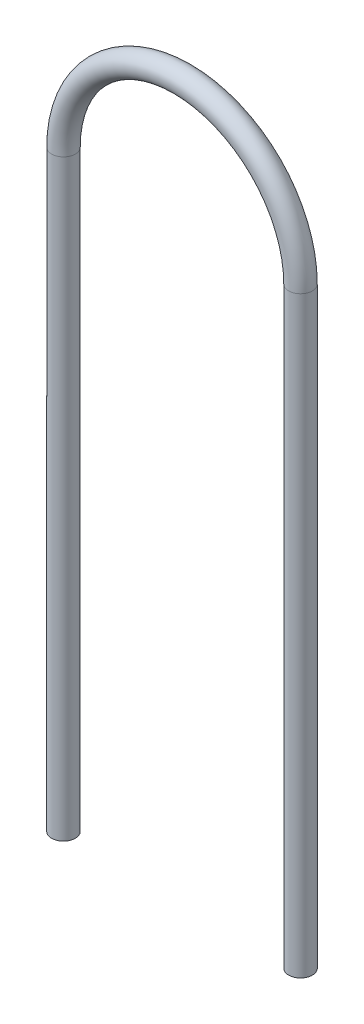
ISO-10303-21;
HEADER;
FILE_DESCRIPTION(('STEP AP214'),'2;1');
FILE_NAME('part.step','',(''),(''),'','','');
FILE_SCHEMA(('AUTOMOTIVE_DESIGN { 1 0 10303 214 1 1 1 1 }'));
ENDSEC;
DATA;
#1=APPLICATION_CONTEXT('core data for automotive mechanical design processes');
#2=APPLICATION_PROTOCOL_DEFINITION('international standard','automotive_design',2000,#1);
#3=PRODUCT_CONTEXT('',#1,'mechanical');
#4=PRODUCT('Part','Part','',(#3));
#5=PRODUCT_RELATED_PRODUCT_CATEGORY('part','',(#4));
#6=PRODUCT_DEFINITION_FORMATION('','',#4);
#7=PRODUCT_DEFINITION_CONTEXT('part definition',#1,'design');
#8=PRODUCT_DEFINITION('design','',#6,#7);
#9=PRODUCT_DEFINITION_SHAPE('','',#8);
#10=(LENGTH_UNIT() NAMED_UNIT(*) SI_UNIT(.MILLI.,.METRE.));
#11=(NAMED_UNIT(*) PLANE_ANGLE_UNIT() SI_UNIT($,.RADIAN.));
#12=(NAMED_UNIT(*) SI_UNIT($,.STERADIAN.) SOLID_ANGLE_UNIT());
#13=UNCERTAINTY_MEASURE_WITH_UNIT(LENGTH_MEASURE(1.E-05),#10,'distance_accuracy_value','');
#14=(GEOMETRIC_REPRESENTATION_CONTEXT(3) GLOBAL_UNCERTAINTY_ASSIGNED_CONTEXT((#13)) GLOBAL_UNIT_ASSIGNED_CONTEXT((#10,
#11,#12)) REPRESENTATION_CONTEXT('',''));
#15=CARTESIAN_POINT('',(0.,0.,0.));
#16=DIRECTION('',(0.,0.,1.));
#17=DIRECTION('',(1.,0.,0.));
#18=AXIS2_PLACEMENT_3D('',#15,#16,#17);
#19=CARTESIAN_POINT('',(0.,0.,0.));
#20=DIRECTION('',(0.,1.,0.));
#21=DIRECTION('',(0.,0.,1.));
#22=AXIS2_PLACEMENT_3D('',#19,#20,#21);
#23=PLANE('',#22);
#24=CARTESIAN_POINT('',(0.,0.,0.));
#25=DIRECTION('',(0.,1.,0.));
#26=DIRECTION('',(0.,0.,1.));
#27=AXIS2_PLACEMENT_3D('',#24,#25,#26);
#28=CIRCLE('',#27,10.);
#29=CARTESIAN_POINT('',(0.,0.,10.));
#30=VERTEX_POINT('',#29);
#31=EDGE_CURVE('E59',#30,#30,#28,.T.);
#32=ORIENTED_EDGE('',*,*,#31,.F.);
#33=EDGE_LOOP('',(#32));
#34=FACE_BOUND('',#33,.T.);
#35=ADVANCED_FACE('F41',(#34),#23,.F.);
#36=CARTESIAN_POINT('',(200.,0.,0.));
#37=DIRECTION('',(0.,-1.,0.));
#38=DIRECTION('',(0.,0.,1.));
#39=AXIS2_PLACEMENT_3D('',#36,#37,#38);
#40=PLANE('',#39);
#41=CARTESIAN_POINT('',(200.,0.,0.));
#42=DIRECTION('',(0.,-1.,0.));
#43=DIRECTION('',(0.,0.,1.));
#44=AXIS2_PLACEMENT_3D('',#41,#42,#43);
#45=CIRCLE('',#44,10.);
#46=CARTESIAN_POINT('',(200.,0.,10.));
#47=VERTEX_POINT('',#46);
#48=EDGE_CURVE('E10',#47,#47,#45,.T.);
#49=ORIENTED_EDGE('',*,*,#48,.T.);
#50=EDGE_LOOP('',(#49));
#51=FACE_BOUND('',#50,.T.);
#52=ADVANCED_FACE('F68',(#51),#40,.T.);
#53=CARTESIAN_POINT('',(0.,0.,0.));
#54=DIRECTION('',(0.,1.,0.));
#55=DIRECTION('',(0.,0.,1.));
#56=AXIS2_PLACEMENT_3D('',#53,#54,#55);
#57=CYLINDRICAL_SURFACE('',#56,10.);
#58=CARTESIAN_POINT('',(0.,500.,0.));
#59=DIRECTION('',(0.,1.,0.));
#60=DIRECTION('',(0.,0.,1.));
#61=AXIS2_PLACEMENT_3D('',#58,#59,#60);
#62=CIRCLE('',#61,10.);
#63=CARTESIAN_POINT('',(-10.0000000000001,500.,0.));
#64=VERTEX_POINT('',#63);
#65=EDGE_CURVE('E55',#64,#64,#62,.T.);
#66=ORIENTED_EDGE('',*,*,#65,.F.);
#67=EDGE_LOOP('',(#66));
#68=FACE_BOUND('',#67,.T.);
#69=ORIENTED_EDGE('',*,*,#31,.T.);
#70=EDGE_LOOP('',(#69));
#71=FACE_BOUND('',#70,.T.);
#72=ADVANCED_FACE('F65',(#68,#71),#57,.T.);
#73=CARTESIAN_POINT('',(99.9999999999999,500.,0.));
#74=DIRECTION('',(0.,0.,-1.));
#75=DIRECTION('',(-1.,0.,0.));
#76=AXIS2_PLACEMENT_3D('',#73,#74,#75);
#77=TOROIDAL_SURFACE('',#76,99.9999999999999,10.);
#78=CARTESIAN_POINT('',(200.,500.,0.));
#79=DIRECTION('',(0.,-1.,0.));
#80=DIRECTION('',(0.,0.,1.));
#81=AXIS2_PLACEMENT_3D('',#78,#79,#80);
#82=CIRCLE('',#81,10.);
#83=CARTESIAN_POINT('',(210.,500.,0.));
#84=VERTEX_POINT('',#83);
#85=EDGE_CURVE('E48',#84,#84,#82,.T.);
#86=CARTESIAN_POINT('',(99.9999999999999,500.,0.));
#87=DIRECTION('',(0.,0.,-1.));
#88=DIRECTION('',(-1.,0.,0.));
#89=AXIS2_PLACEMENT_3D('',#86,#87,#88);
#90=CIRCLE('',#89,110.);
#91=EDGE_CURVE('',#64,#84,#90,.T.);
#92=ORIENTED_EDGE('',*,*,#65,.T.);
#93=ORIENTED_EDGE('',*,*,#85,.F.);
#94=ORIENTED_EDGE('',*,*,#91,.T.);
#95=ORIENTED_EDGE('',*,*,#91,.F.);
#96=EDGE_LOOP('',(#92,#94,#93,#95));
#97=FACE_BOUND('',#96,.T.);
#98=ADVANCED_FACE('F74',(#97),#77,.T.);
#99=CARTESIAN_POINT('',(200.,500.,0.));
#100=DIRECTION('',(0.,-1.,0.));
#101=DIRECTION('',(1.,0.,0.));
#102=AXIS2_PLACEMENT_3D('',#99,#100,#101);
#103=CYLINDRICAL_SURFACE('',#102,10.);
#104=ORIENTED_EDGE('',*,*,#48,.F.);
#105=EDGE_LOOP('',(#104));
#106=FACE_BOUND('',#105,.T.);
#107=ORIENTED_EDGE('',*,*,#85,.T.);
#108=EDGE_LOOP('',(#107));
#109=FACE_BOUND('',#108,.T.);
#110=ADVANCED_FACE('F72',(#106,#109),#103,.T.);
#111=CLOSED_SHELL('',(#35,#52,#72,#98,#110));
#112=MANIFOLD_SOLID_BREP('B2',#111);
#113=ADVANCED_BREP_SHAPE_REPRESENTATION('',(#18,#112),#14);
#114=SHAPE_DEFINITION_REPRESENTATION(#9,#113);
ENDSEC;
END-ISO-10303-21;
